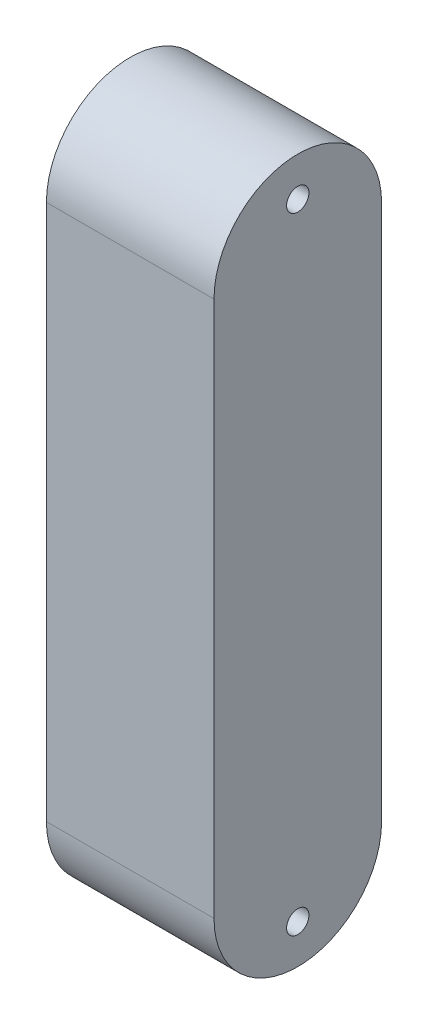
ISO-10303-21;
HEADER;
FILE_DESCRIPTION(('STEP AP214'),'2;1');
FILE_NAME('part.step','',(''),(''),'','','');
FILE_SCHEMA(('AUTOMOTIVE_DESIGN { 1 0 10303 214 1 1 1 1 }'));
ENDSEC;
DATA;
#1=APPLICATION_CONTEXT('core data for automotive mechanical design processes');
#2=APPLICATION_PROTOCOL_DEFINITION('international standard','automotive_design',2000,#1);
#3=PRODUCT_CONTEXT('',#1,'mechanical');
#4=PRODUCT('Part','Part','',(#3));
#5=PRODUCT_RELATED_PRODUCT_CATEGORY('part','',(#4));
#6=PRODUCT_DEFINITION_FORMATION('','',#4);
#7=PRODUCT_DEFINITION_CONTEXT('part definition',#1,'design');
#8=PRODUCT_DEFINITION('design','',#6,#7);
#9=PRODUCT_DEFINITION_SHAPE('','',#8);
#10=(LENGTH_UNIT() NAMED_UNIT(*) SI_UNIT(.MILLI.,.METRE.));
#11=(NAMED_UNIT(*) PLANE_ANGLE_UNIT() SI_UNIT($,.RADIAN.));
#12=(NAMED_UNIT(*) SI_UNIT($,.STERADIAN.) SOLID_ANGLE_UNIT());
#13=UNCERTAINTY_MEASURE_WITH_UNIT(LENGTH_MEASURE(1.E-05),#10,'distance_accuracy_value','');
#14=(GEOMETRIC_REPRESENTATION_CONTEXT(3) GLOBAL_UNCERTAINTY_ASSIGNED_CONTEXT((#13)) GLOBAL_UNIT_ASSIGNED_CONTEXT((#10,
#11,#12)) REPRESENTATION_CONTEXT('',''));
#15=CARTESIAN_POINT('',(0.,0.,0.));
#16=DIRECTION('',(0.,0.,1.));
#17=DIRECTION('',(1.,0.,0.));
#18=AXIS2_PLACEMENT_3D('',#15,#16,#17);
#19=CARTESIAN_POINT('',(7.5,7.5,0.));
#20=DIRECTION('',(1.,0.,0.));
#21=DIRECTION('',(0.,0.,-1.));
#22=AXIS2_PLACEMENT_3D('',#19,#20,#21);
#23=CYLINDRICAL_SURFACE('',#22,7.5);
#24=DIRECTION('',(1.,0.,0.));
#25=VECTOR('',#24,1.);
#26=CARTESIAN_POINT('',(-7.5,7.5,-7.5));
#27=LINE('',#26,#25);
#28=CARTESIAN_POINT('',(7.5,7.5,-7.5));
#29=VERTEX_POINT('',#28);
#30=CARTESIAN_POINT('',(-7.5,7.5,-7.5));
#31=VERTEX_POINT('',#30);
#32=EDGE_CURVE('E105',#29,#31,#27,.F.);
#33=ORIENTED_EDGE('',*,*,#32,.F.);
#34=CARTESIAN_POINT('',(7.5,7.5,0.));
#35=DIRECTION('',(1.,0.,0.));
#36=DIRECTION('',(0.,0.,-1.));
#37=AXIS2_PLACEMENT_3D('',#34,#35,#36);
#38=CIRCLE('',#37,7.5);
#39=CARTESIAN_POINT('',(7.5,7.5,7.5));
#40=VERTEX_POINT('',#39);
#41=EDGE_CURVE('E43',#40,#29,#38,.T.);
#42=ORIENTED_EDGE('',*,*,#41,.F.);
#43=DIRECTION('',(-1.,0.,0.));
#44=VECTOR('',#43,1.);
#45=CARTESIAN_POINT('',(7.5,7.5,7.5));
#46=LINE('',#45,#44);
#47=CARTESIAN_POINT('',(-7.5,7.5,7.5));
#48=VERTEX_POINT('',#47);
#49=EDGE_CURVE('E95',#48,#40,#46,.F.);
#50=ORIENTED_EDGE('',*,*,#49,.F.);
#51=CARTESIAN_POINT('',(-7.5,7.5,0.));
#52=DIRECTION('',(1.,0.,0.));
#53=DIRECTION('',(0.,0.,-1.));
#54=AXIS2_PLACEMENT_3D('',#51,#52,#53);
#55=CIRCLE('',#54,7.5);
#56=EDGE_CURVE('E11',#31,#48,#55,.F.);
#57=ORIENTED_EDGE('',*,*,#56,.F.);
#58=EDGE_LOOP('',(#33,#42,#50,#57));
#59=FACE_BOUND('',#58,.T.);
#60=ADVANCED_FACE('F35',(#59),#23,.T.);
#61=CARTESIAN_POINT('',(7.5,55.5,0.));
#62=DIRECTION('',(1.,0.,0.));
#63=DIRECTION('',(0.,0.,-1.));
#64=AXIS2_PLACEMENT_3D('',#61,#62,#63);
#65=CYLINDRICAL_SURFACE('',#64,7.5);
#66=DIRECTION('',(1.,0.,0.));
#67=VECTOR('',#66,1.);
#68=CARTESIAN_POINT('',(-7.5,55.5,7.5));
#69=LINE('',#68,#67);
#70=CARTESIAN_POINT('',(7.5,55.5,7.5));
#71=VERTEX_POINT('',#70);
#72=CARTESIAN_POINT('',(-7.5,55.5,7.5));
#73=VERTEX_POINT('',#72);
#74=EDGE_CURVE('E88',#71,#73,#69,.F.);
#75=ORIENTED_EDGE('',*,*,#74,.F.);
#76=CARTESIAN_POINT('',(7.5,55.5,0.));
#77=DIRECTION('',(1.,0.,0.));
#78=DIRECTION('',(0.,0.,-1.));
#79=AXIS2_PLACEMENT_3D('',#76,#77,#78);
#80=CIRCLE('',#79,7.5);
#81=CARTESIAN_POINT('',(7.5,55.5,-7.5));
#82=VERTEX_POINT('',#81);
#83=EDGE_CURVE('E74',#82,#71,#80,.T.);
#84=ORIENTED_EDGE('',*,*,#83,.F.);
#85=DIRECTION('',(-1.,0.,0.));
#86=VECTOR('',#85,1.);
#87=CARTESIAN_POINT('',(7.5,55.5,-7.5));
#88=LINE('',#87,#86);
#89=CARTESIAN_POINT('',(-7.5,55.5,-7.5));
#90=VERTEX_POINT('',#89);
#91=EDGE_CURVE('E85',#90,#82,#88,.F.);
#92=ORIENTED_EDGE('',*,*,#91,.F.);
#93=CARTESIAN_POINT('',(-7.5,55.5,0.));
#94=DIRECTION('',(1.,0.,0.));
#95=DIRECTION('',(0.,0.,-1.));
#96=AXIS2_PLACEMENT_3D('',#93,#94,#95);
#97=CIRCLE('',#96,7.5);
#98=EDGE_CURVE('E84',#73,#90,#97,.F.);
#99=ORIENTED_EDGE('',*,*,#98,.F.);
#100=EDGE_LOOP('',(#75,#84,#92,#99));
#101=FACE_BOUND('',#100,.T.);
#102=ADVANCED_FACE('F89',(#101),#65,.T.);
#103=CARTESIAN_POINT('',(-7.5,63.,-7.5));
#104=DIRECTION('',(0.,0.,-1.));
#105=DIRECTION('',(-1.,0.,0.));
#106=AXIS2_PLACEMENT_3D('',#103,#104,#105);
#107=PLANE('',#106);
#108=DIRECTION('',(0.,-1.,0.));
#109=VECTOR('',#108,1.);
#110=CARTESIAN_POINT('',(7.5,63.,-7.5));
#111=LINE('',#110,#109);
#112=EDGE_CURVE('E80',#82,#29,#111,.T.);
#113=ORIENTED_EDGE('',*,*,#112,.T.);
#114=ORIENTED_EDGE('',*,*,#32,.T.);
#115=DIRECTION('',(0.,-1.,0.));
#116=VECTOR('',#115,1.);
#117=CARTESIAN_POINT('',(-7.5,63.,-7.5));
#118=LINE('',#117,#116);
#119=EDGE_CURVE('E92',#90,#31,#118,.T.);
#120=ORIENTED_EDGE('',*,*,#119,.F.);
#121=ORIENTED_EDGE('',*,*,#91,.T.);
#122=EDGE_LOOP('',(#113,#114,#120,#121));
#123=FACE_BOUND('',#122,.T.);
#124=ADVANCED_FACE('F110',(#123),#107,.T.);
#125=CARTESIAN_POINT('',(-7.5,63.,-7.5));
#126=DIRECTION('',(1.,0.,0.));
#127=DIRECTION('',(0.,0.,-1.));
#128=AXIS2_PLACEMENT_3D('',#125,#126,#127);
#129=PLANE('',#128);
#130=CARTESIAN_POINT('',(-7.5,59.5,0.));
#131=DIRECTION('',(1.,0.,0.));
#132=DIRECTION('',(0.,0.,-1.));
#133=AXIS2_PLACEMENT_3D('',#130,#131,#132);
#134=CIRCLE('',#133,1.);
#135=CARTESIAN_POINT('',(-7.5,59.5,-0.999999999999999));
#136=VERTEX_POINT('',#135);
#137=EDGE_CURVE('E99',#136,#136,#134,.T.);
#138=ORIENTED_EDGE('',*,*,#137,.T.);
#139=EDGE_LOOP('',(#138));
#140=FACE_BOUND('',#139,.T.);
#141=CARTESIAN_POINT('',(-7.5,3.5,0.));
#142=DIRECTION('',(1.,0.,0.));
#143=DIRECTION('',(0.,0.,-1.));
#144=AXIS2_PLACEMENT_3D('',#141,#142,#143);
#145=CIRCLE('',#144,1.);
#146=CARTESIAN_POINT('',(-7.5,3.5,-0.999999999999998));
#147=VERTEX_POINT('',#146);
#148=EDGE_CURVE('E115',#147,#147,#145,.T.);
#149=ORIENTED_EDGE('',*,*,#148,.T.);
#150=EDGE_LOOP('',(#149));
#151=FACE_BOUND('',#150,.T.);
#152=ORIENTED_EDGE('',*,*,#119,.T.);
#153=ORIENTED_EDGE('',*,*,#56,.T.);
#154=DIRECTION('',(0.,-1.,0.));
#155=VECTOR('',#154,1.);
#156=CARTESIAN_POINT('',(-7.5,63.,7.5));
#157=LINE('',#156,#155);
#158=EDGE_CURVE('E96',#73,#48,#157,.T.);
#159=ORIENTED_EDGE('',*,*,#158,.F.);
#160=ORIENTED_EDGE('',*,*,#98,.T.);
#161=EDGE_LOOP('',(#152,#153,#159,#160));
#162=FACE_BOUND('',#161,.T.);
#163=ADVANCED_FACE('F124',(#140,#151,#162),#129,.F.);
#164=CARTESIAN_POINT('',(-7.5,63.,7.5));
#165=DIRECTION('',(0.,0.,-1.));
#166=DIRECTION('',(-1.,0.,0.));
#167=AXIS2_PLACEMENT_3D('',#164,#165,#166);
#168=PLANE('',#167);
#169=ORIENTED_EDGE('',*,*,#158,.T.);
#170=ORIENTED_EDGE('',*,*,#49,.T.);
#171=DIRECTION('',(0.,-1.,0.));
#172=VECTOR('',#171,1.);
#173=CARTESIAN_POINT('',(7.5,63.,7.5));
#174=LINE('',#173,#172);
#175=EDGE_CURVE('E78',#71,#40,#174,.T.);
#176=ORIENTED_EDGE('',*,*,#175,.F.);
#177=ORIENTED_EDGE('',*,*,#74,.T.);
#178=EDGE_LOOP('',(#169,#170,#176,#177));
#179=FACE_BOUND('',#178,.T.);
#180=ADVANCED_FACE('F94',(#179),#168,.F.);
#181=CARTESIAN_POINT('',(7.5,63.,-7.5));
#182=DIRECTION('',(1.,0.,0.));
#183=DIRECTION('',(0.,0.,-1.));
#184=AXIS2_PLACEMENT_3D('',#181,#182,#183);
#185=PLANE('',#184);
#186=CARTESIAN_POINT('',(7.5,59.5,0.));
#187=DIRECTION('',(1.,0.,0.));
#188=DIRECTION('',(0.,0.,-1.));
#189=AXIS2_PLACEMENT_3D('',#186,#187,#188);
#190=CIRCLE('',#189,1.);
#191=CARTESIAN_POINT('',(7.5,59.5,-1.));
#192=VERTEX_POINT('',#191);
#193=EDGE_CURVE('E118',#192,#192,#190,.T.);
#194=ORIENTED_EDGE('',*,*,#193,.F.);
#195=EDGE_LOOP('',(#194));
#196=FACE_BOUND('',#195,.T.);
#197=CARTESIAN_POINT('',(7.5,3.5,0.));
#198=DIRECTION('',(1.,0.,0.));
#199=DIRECTION('',(0.,0.,-1.));
#200=AXIS2_PLACEMENT_3D('',#197,#198,#199);
#201=CIRCLE('',#200,1.);
#202=CARTESIAN_POINT('',(7.5,3.5,-1.));
#203=VERTEX_POINT('',#202);
#204=EDGE_CURVE('E112',#203,#203,#201,.T.);
#205=ORIENTED_EDGE('',*,*,#204,.F.);
#206=EDGE_LOOP('',(#205));
#207=FACE_BOUND('',#206,.T.);
#208=ORIENTED_EDGE('',*,*,#175,.T.);
#209=ORIENTED_EDGE('',*,*,#41,.T.);
#210=ORIENTED_EDGE('',*,*,#112,.F.);
#211=ORIENTED_EDGE('',*,*,#83,.T.);
#212=EDGE_LOOP('',(#208,#209,#210,#211));
#213=FACE_BOUND('',#212,.T.);
#214=ADVANCED_FACE('F76',(#196,#207,#213),#185,.T.);
#215=CARTESIAN_POINT('',(-7.5,3.5,0.));
#216=DIRECTION('',(1.,0.,0.));
#217=DIRECTION('',(0.,0.,-1.));
#218=AXIS2_PLACEMENT_3D('',#215,#216,#217);
#219=CYLINDRICAL_SURFACE('',#218,1.);
#220=ORIENTED_EDGE('',*,*,#148,.F.);
#221=EDGE_LOOP('',(#220));
#222=FACE_BOUND('',#221,.T.);
#223=ORIENTED_EDGE('',*,*,#204,.T.);
#224=EDGE_LOOP('',(#223));
#225=FACE_BOUND('',#224,.T.);
#226=ADVANCED_FACE('F130',(#222,#225),#219,.F.);
#227=CARTESIAN_POINT('',(-7.5,59.5,0.));
#228=DIRECTION('',(1.,0.,0.));
#229=DIRECTION('',(0.,0.,-1.));
#230=AXIS2_PLACEMENT_3D('',#227,#228,#229);
#231=CYLINDRICAL_SURFACE('',#230,1.);
#232=ORIENTED_EDGE('',*,*,#137,.F.);
#233=EDGE_LOOP('',(#232));
#234=FACE_BOUND('',#233,.T.);
#235=ORIENTED_EDGE('',*,*,#193,.T.);
#236=EDGE_LOOP('',(#235));
#237=FACE_BOUND('',#236,.T.);
#238=ADVANCED_FACE('F127',(#234,#237),#231,.F.);
#239=CLOSED_SHELL('',(#60,#102,#124,#163,#180,#214,#226,#238));
#240=MANIFOLD_SOLID_BREP('B2',#239);
#241=ADVANCED_BREP_SHAPE_REPRESENTATION('',(#18,#240),#14);
#242=SHAPE_DEFINITION_REPRESENTATION(#9,#241);
ENDSEC;
END-ISO-10303-21;
